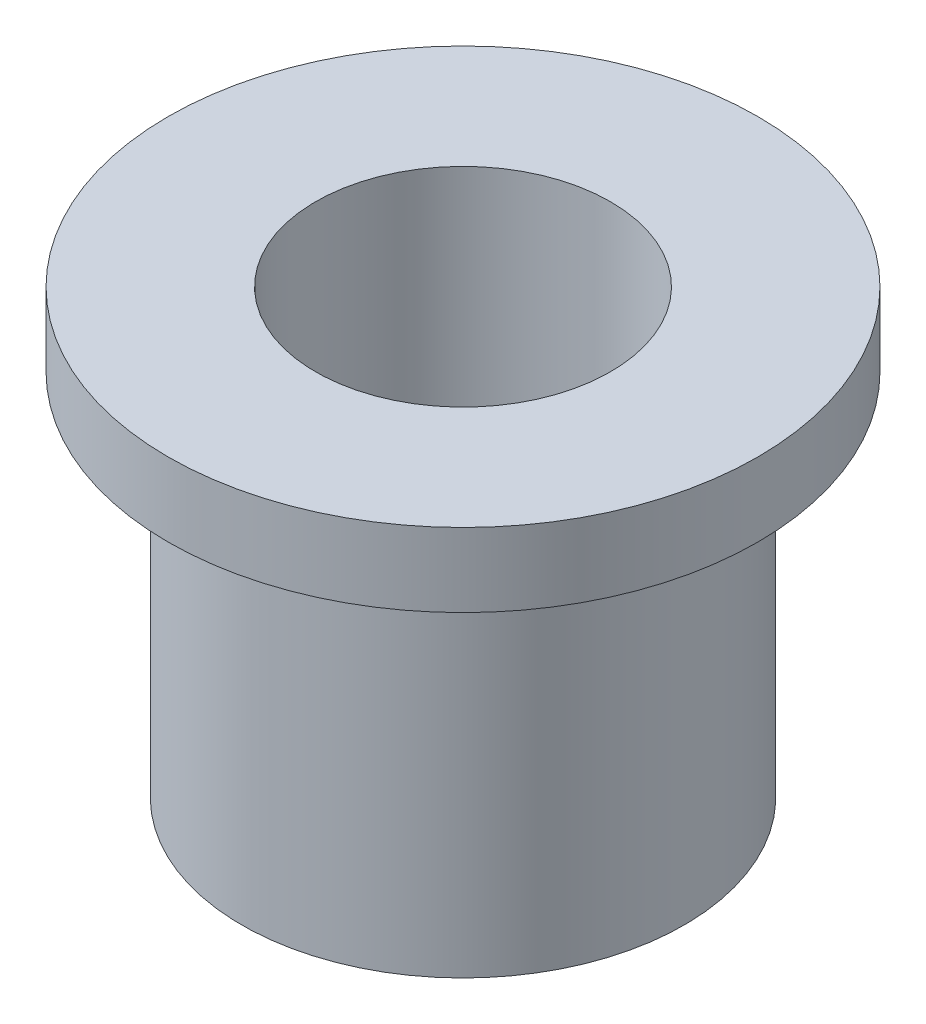
ISO-10303-21;
HEADER;
FILE_DESCRIPTION(('STEP AP214'),'2;1');
FILE_NAME('part.step','',(''),(''),'','','');
FILE_SCHEMA(('AUTOMOTIVE_DESIGN { 1 0 10303 214 1 1 1 1 }'));
ENDSEC;
DATA;
#1=APPLICATION_CONTEXT('core data for automotive mechanical design processes');
#2=APPLICATION_PROTOCOL_DEFINITION('international standard','automotive_design',2000,#1);
#3=PRODUCT_CONTEXT('',#1,'mechanical');
#4=PRODUCT('Part','Part','',(#3));
#5=PRODUCT_RELATED_PRODUCT_CATEGORY('part','',(#4));
#6=PRODUCT_DEFINITION_FORMATION('','',#4);
#7=PRODUCT_DEFINITION_CONTEXT('part definition',#1,'design');
#8=PRODUCT_DEFINITION('design','',#6,#7);
#9=PRODUCT_DEFINITION_SHAPE('','',#8);
#10=(LENGTH_UNIT() NAMED_UNIT(*) SI_UNIT(.MILLI.,.METRE.));
#11=(NAMED_UNIT(*) PLANE_ANGLE_UNIT() SI_UNIT($,.RADIAN.));
#12=(NAMED_UNIT(*) SI_UNIT($,.STERADIAN.) SOLID_ANGLE_UNIT());
#13=UNCERTAINTY_MEASURE_WITH_UNIT(LENGTH_MEASURE(1.E-05),#10,'distance_accuracy_value','');
#14=(GEOMETRIC_REPRESENTATION_CONTEXT(3) GLOBAL_UNCERTAINTY_ASSIGNED_CONTEXT((#13)) GLOBAL_UNIT_ASSIGNED_CONTEXT((#10,
#11,#12)) REPRESENTATION_CONTEXT('',''));
#15=CARTESIAN_POINT('',(0.,0.,0.));
#16=DIRECTION('',(0.,0.,1.));
#17=DIRECTION('',(1.,0.,0.));
#18=AXIS2_PLACEMENT_3D('',#15,#16,#17);
#19=CARTESIAN_POINT('',(0.,0.,-4.7625));
#20=DIRECTION('',(0.,-1.,0.));
#21=DIRECTION('',(0.,0.,-0.999999999999993));
#22=AXIS2_PLACEMENT_3D('',#19,#20,#21);
#23=PLANE('',#22);
#24=CARTESIAN_POINT('',(0.,0.,0.));
#25=DIRECTION('',(0.,-1.,0.));
#26=DIRECTION('',(0.,0.,-0.999999999999993));
#27=AXIS2_PLACEMENT_3D('',#24,#25,#26);
#28=CIRCLE('',#27,4.7625);
#29=CARTESIAN_POINT('',(0.,0.,-4.76249999999997));
#30=VERTEX_POINT('',#29);
#31=EDGE_CURVE('E54',#30,#30,#28,.T.);
#32=ORIENTED_EDGE('',*,*,#31,.T.);
#33=EDGE_LOOP('',(#32));
#34=FACE_BOUND('',#33,.T.);
#35=CARTESIAN_POINT('',(0.,0.,0.));
#36=DIRECTION('',(0.,-1.,0.));
#37=DIRECTION('',(0.,0.,-0.999999999999993));
#38=AXIS2_PLACEMENT_3D('',#35,#36,#37);
#39=CIRCLE('',#38,3.175);
#40=CARTESIAN_POINT('',(0.,0.,-3.17499999999998));
#41=VERTEX_POINT('',#40);
#42=EDGE_CURVE('E10',#41,#41,#39,.T.);
#43=ORIENTED_EDGE('',*,*,#42,.F.);
#44=EDGE_LOOP('',(#43));
#45=FACE_BOUND('',#44,.T.);
#46=ADVANCED_FACE('F32',(#34,#45),#23,.T.);
#47=CARTESIAN_POINT('',(0.,0.,0.));
#48=DIRECTION('',(0.,-1.,0.));
#49=DIRECTION('',(0.,0.,-0.999999999999993));
#50=AXIS2_PLACEMENT_3D('',#47,#48,#49);
#51=CYLINDRICAL_SURFACE('',#50,3.175);
#52=ORIENTED_EDGE('',*,*,#42,.T.);
#53=EDGE_LOOP('',(#52));
#54=FACE_BOUND('',#53,.T.);
#55=CARTESIAN_POINT('',(0.,9.52500000000001,0.));
#56=DIRECTION('',(0.,-1.,0.));
#57=DIRECTION('',(0.,0.,-0.999999999999993));
#58=AXIS2_PLACEMENT_3D('',#55,#56,#57);
#59=CIRCLE('',#58,3.175);
#60=CARTESIAN_POINT('',(0.,9.52500000000001,-3.175));
#61=VERTEX_POINT('',#60);
#62=EDGE_CURVE('E38',#61,#61,#59,.T.);
#63=ORIENTED_EDGE('',*,*,#62,.F.);
#64=EDGE_LOOP('',(#63));
#65=FACE_BOUND('',#64,.T.);
#66=ADVANCED_FACE('F72',(#54,#65),#51,.F.);
#67=CARTESIAN_POINT('',(-1.2490009027033E-13,9.52500000000001,-3.17499999999997));
#68=DIRECTION('',(0.,1.,0.));
#69=DIRECTION('',(0.,0.,0.999999999999993));
#70=AXIS2_PLACEMENT_3D('',#67,#68,#69);
#71=PLANE('',#70);
#72=ORIENTED_EDGE('',*,*,#62,.T.);
#73=EDGE_LOOP('',(#72));
#74=FACE_BOUND('',#73,.T.);
#75=CARTESIAN_POINT('',(0.,9.52500000000001,0.));
#76=DIRECTION('',(0.,-1.,0.));
#77=DIRECTION('',(0.,0.,-0.999999999999993));
#78=AXIS2_PLACEMENT_3D('',#75,#76,#77);
#79=CIRCLE('',#78,6.35);
#80=CARTESIAN_POINT('',(0.,9.52500000000001,-6.34999999999998));
#81=VERTEX_POINT('',#80);
#82=EDGE_CURVE('E42',#81,#81,#79,.T.);
#83=ORIENTED_EDGE('',*,*,#82,.F.);
#84=EDGE_LOOP('',(#83));
#85=FACE_BOUND('',#84,.T.);
#86=ADVANCED_FACE('F76',(#74,#85),#71,.T.);
#87=CARTESIAN_POINT('',(0.,0.,0.));
#88=DIRECTION('',(0.,-1.,0.));
#89=DIRECTION('',(0.,0.,-0.999999999999993));
#90=AXIS2_PLACEMENT_3D('',#87,#88,#89);
#91=CYLINDRICAL_SURFACE('',#90,6.35);
#92=ORIENTED_EDGE('',*,*,#82,.T.);
#93=EDGE_LOOP('',(#92));
#94=FACE_BOUND('',#93,.T.);
#95=CARTESIAN_POINT('',(0.,7.93749999999999,0.));
#96=DIRECTION('',(0.,-1.,0.));
#97=DIRECTION('',(0.,0.,-0.999999999999993));
#98=AXIS2_PLACEMENT_3D('',#95,#96,#97);
#99=CIRCLE('',#98,6.35);
#100=CARTESIAN_POINT('',(0.,7.93749999999999,-6.34999999999996));
#101=VERTEX_POINT('',#100);
#102=EDGE_CURVE('E46',#101,#101,#99,.T.);
#103=ORIENTED_EDGE('',*,*,#102,.F.);
#104=EDGE_LOOP('',(#103));
#105=FACE_BOUND('',#104,.T.);
#106=ADVANCED_FACE('F68',(#94,#105),#91,.T.);
#107=CARTESIAN_POINT('',(0.,7.93749999999999,-6.34999999999996));
#108=DIRECTION('',(0.,-1.,0.));
#109=DIRECTION('',(0.,0.,-0.999999999999993));
#110=AXIS2_PLACEMENT_3D('',#107,#108,#109);
#111=PLANE('',#110);
#112=ORIENTED_EDGE('',*,*,#102,.T.);
#113=EDGE_LOOP('',(#112));
#114=FACE_BOUND('',#113,.T.);
#115=CARTESIAN_POINT('',(0.,7.93749999999999,0.));
#116=DIRECTION('',(0.,-1.,0.));
#117=DIRECTION('',(0.,0.,-0.999999999999993));
#118=AXIS2_PLACEMENT_3D('',#115,#116,#117);
#119=CIRCLE('',#118,4.7625);
#120=CARTESIAN_POINT('',(0.,7.93749999999999,-4.76249999999997));
#121=VERTEX_POINT('',#120);
#122=EDGE_CURVE('E51',#121,#121,#119,.T.);
#123=ORIENTED_EDGE('',*,*,#122,.F.);
#124=EDGE_LOOP('',(#123));
#125=FACE_BOUND('',#124,.T.);
#126=ADVANCED_FACE('F62',(#114,#125),#111,.T.);
#127=CARTESIAN_POINT('',(0.,0.,0.));
#128=DIRECTION('',(0.,-1.,0.));
#129=DIRECTION('',(0.,0.,-0.999999999999993));
#130=AXIS2_PLACEMENT_3D('',#127,#128,#129);
#131=CYLINDRICAL_SURFACE('',#130,4.7625);
#132=ORIENTED_EDGE('',*,*,#122,.T.);
#133=EDGE_LOOP('',(#132));
#134=FACE_BOUND('',#133,.T.);
#135=ORIENTED_EDGE('',*,*,#31,.F.);
#136=EDGE_LOOP('',(#135));
#137=FACE_BOUND('',#136,.T.);
#138=ADVANCED_FACE('F60',(#134,#137),#131,.T.);
#139=CLOSED_SHELL('',(#46,#66,#86,#106,#126,#138));
#140=MANIFOLD_SOLID_BREP('B2',#139);
#141=ADVANCED_BREP_SHAPE_REPRESENTATION('',(#18,#140),#14);
#142=SHAPE_DEFINITION_REPRESENTATION(#9,#141);
ENDSEC;
END-ISO-10303-21;
